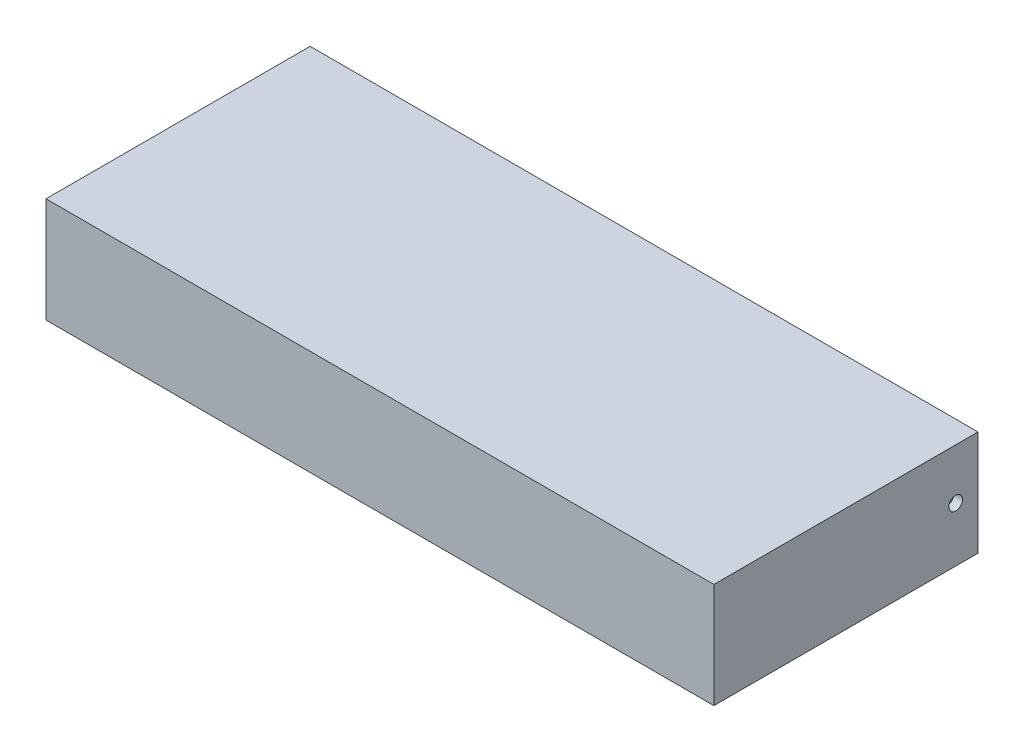
ISO-10303-21;
HEADER;
FILE_DESCRIPTION(('STEP AP214'),'2;1');
FILE_NAME('part.step','',(''),(''),'','','');
FILE_SCHEMA(('AUTOMOTIVE_DESIGN { 1 0 10303 214 1 1 1 1 }'));
ENDSEC;
DATA;
#1=APPLICATION_CONTEXT('core data for automotive mechanical design processes');
#2=APPLICATION_PROTOCOL_DEFINITION('international standard','automotive_design',2000,#1);
#3=PRODUCT_CONTEXT('',#1,'mechanical');
#4=PRODUCT('Part','Part','',(#3));
#5=PRODUCT_RELATED_PRODUCT_CATEGORY('part','',(#4));
#6=PRODUCT_DEFINITION_FORMATION('','',#4);
#7=PRODUCT_DEFINITION_CONTEXT('part definition',#1,'design');
#8=PRODUCT_DEFINITION('design','',#6,#7);
#9=PRODUCT_DEFINITION_SHAPE('','',#8);
#10=(LENGTH_UNIT() NAMED_UNIT(*) SI_UNIT(.MILLI.,.METRE.));
#11=(NAMED_UNIT(*) PLANE_ANGLE_UNIT() SI_UNIT($,.RADIAN.));
#12=(NAMED_UNIT(*) SI_UNIT($,.STERADIAN.) SOLID_ANGLE_UNIT());
#13=UNCERTAINTY_MEASURE_WITH_UNIT(LENGTH_MEASURE(1.E-05),#10,'distance_accuracy_value','');
#14=(GEOMETRIC_REPRESENTATION_CONTEXT(3) GLOBAL_UNCERTAINTY_ASSIGNED_CONTEXT((#13)) GLOBAL_UNIT_ASSIGNED_CONTEXT((#10,
#11,#12)) REPRESENTATION_CONTEXT('',''));
#15=CARTESIAN_POINT('',(0.,0.,0.));
#16=DIRECTION('',(0.,0.,1.));
#17=DIRECTION('',(1.,0.,0.));
#18=AXIS2_PLACEMENT_3D('',#15,#16,#17);
#19=CARTESIAN_POINT('',(-760.,239.,-300.5));
#20=DIRECTION('',(1.,0.,0.));
#21=DIRECTION('',(0.,0.,-1.));
#22=AXIS2_PLACEMENT_3D('',#19,#20,#21);
#23=PLANE('',#22);
#24=DIRECTION('',(0.,0.,1.));
#25=VECTOR('',#24,1.);
#26=CARTESIAN_POINT('',(-760.,0.,-300.5));
#27=LINE('',#26,#25);
#28=CARTESIAN_POINT('',(-760.,0.,-300.5));
#29=VERTEX_POINT('',#28);
#30=CARTESIAN_POINT('',(-760.,0.,300.5));
#31=VERTEX_POINT('',#30);
#32=EDGE_CURVE('E100',#29,#31,#27,.T.);
#33=ORIENTED_EDGE('',*,*,#32,.T.);
#34=DIRECTION('',(0.,-1.,0.));
#35=VECTOR('',#34,1.);
#36=CARTESIAN_POINT('',(-760.,239.,300.5));
#37=LINE('',#36,#35);
#38=CARTESIAN_POINT('',(-760.,239.,300.5));
#39=VERTEX_POINT('',#38);
#40=EDGE_CURVE('E11',#39,#31,#37,.T.);
#41=ORIENTED_EDGE('',*,*,#40,.F.);
#42=DIRECTION('',(0.,0.,1.));
#43=VECTOR('',#42,1.);
#44=CARTESIAN_POINT('',(-760.,239.,-300.5));
#45=LINE('',#44,#43);
#46=CARTESIAN_POINT('',(-760.,239.,-300.5));
#47=VERTEX_POINT('',#46);
#48=EDGE_CURVE('E88',#47,#39,#45,.T.);
#49=ORIENTED_EDGE('',*,*,#48,.F.);
#50=DIRECTION('',(0.,-1.,0.));
#51=VECTOR('',#50,1.);
#52=CARTESIAN_POINT('',(-760.,239.,-300.5));
#53=LINE('',#52,#51);
#54=EDGE_CURVE('E96',#47,#29,#53,.T.);
#55=ORIENTED_EDGE('',*,*,#54,.T.);
#56=EDGE_LOOP('',(#33,#41,#49,#55));
#57=FACE_BOUND('',#56,.T.);
#58=ADVANCED_FACE('F37',(#57),#23,.F.);
#59=CARTESIAN_POINT('',(760.,239.,300.5));
#60=DIRECTION('',(0.,0.,-1.));
#61=DIRECTION('',(-1.,0.,0.));
#62=AXIS2_PLACEMENT_3D('',#59,#60,#61);
#63=PLANE('',#62);
#64=DIRECTION('',(1.,0.,0.));
#65=VECTOR('',#64,1.);
#66=CARTESIAN_POINT('',(760.,0.,300.5));
#67=LINE('',#66,#65);
#68=CARTESIAN_POINT('',(760.,0.,300.5));
#69=VERTEX_POINT('',#68);
#70=EDGE_CURVE('E92',#31,#69,#67,.T.);
#71=ORIENTED_EDGE('',*,*,#70,.T.);
#72=DIRECTION('',(0.,-1.,0.));
#73=VECTOR('',#72,1.);
#74=CARTESIAN_POINT('',(760.,239.,300.5));
#75=LINE('',#74,#73);
#76=CARTESIAN_POINT('',(760.,239.,300.5));
#77=VERTEX_POINT('',#76);
#78=EDGE_CURVE('E45',#77,#69,#75,.T.);
#79=ORIENTED_EDGE('',*,*,#78,.F.);
#80=DIRECTION('',(1.,0.,0.));
#81=VECTOR('',#80,1.);
#82=CARTESIAN_POINT('',(760.,239.,300.5));
#83=LINE('',#82,#81);
#84=EDGE_CURVE('E83',#39,#77,#83,.T.);
#85=ORIENTED_EDGE('',*,*,#84,.F.);
#86=ORIENTED_EDGE('',*,*,#40,.T.);
#87=EDGE_LOOP('',(#71,#79,#85,#86));
#88=FACE_BOUND('',#87,.T.);
#89=ADVANCED_FACE('F91',(#88),#63,.F.);
#90=CARTESIAN_POINT('',(760.,239.,-300.5));
#91=DIRECTION('',(-1.,0.,0.));
#92=DIRECTION('',(0.,0.,1.));
#93=AXIS2_PLACEMENT_3D('',#90,#91,#92);
#94=PLANE('',#93);
#95=CARTESIAN_POINT('',(760.,124.,-249.7));
#96=DIRECTION('',(1.,0.,0.));
#97=DIRECTION('',(0.,0.,-1.));
#98=AXIS2_PLACEMENT_3D('',#95,#96,#97);
#99=CIRCLE('',#98,15.6);
#100=CARTESIAN_POINT('',(760.,124.,-265.3));
#101=VERTEX_POINT('',#100);
#102=EDGE_CURVE('E114',#101,#101,#99,.T.);
#103=ORIENTED_EDGE('',*,*,#102,.F.);
#104=EDGE_LOOP('',(#103));
#105=FACE_BOUND('',#104,.T.);
#106=DIRECTION('',(0.,0.,-1.));
#107=VECTOR('',#106,1.);
#108=CARTESIAN_POINT('',(760.,0.,-300.5));
#109=LINE('',#108,#107);
#110=CARTESIAN_POINT('',(760.,0.,-300.5));
#111=VERTEX_POINT('',#110);
#112=EDGE_CURVE('E70',#69,#111,#109,.T.);
#113=ORIENTED_EDGE('',*,*,#112,.T.);
#114=DIRECTION('',(0.,-1.,0.));
#115=VECTOR('',#114,1.);
#116=CARTESIAN_POINT('',(760.,239.,-300.5));
#117=LINE('',#116,#115);
#118=CARTESIAN_POINT('',(760.,239.,-300.5));
#119=VERTEX_POINT('',#118);
#120=EDGE_CURVE('E93',#119,#111,#117,.T.);
#121=ORIENTED_EDGE('',*,*,#120,.F.);
#122=DIRECTION('',(0.,0.,-1.));
#123=VECTOR('',#122,1.);
#124=CARTESIAN_POINT('',(760.,239.,-300.5));
#125=LINE('',#124,#123);
#126=EDGE_CURVE('E86',#77,#119,#125,.T.);
#127=ORIENTED_EDGE('',*,*,#126,.F.);
#128=ORIENTED_EDGE('',*,*,#78,.T.);
#129=EDGE_LOOP('',(#113,#121,#127,#128));
#130=FACE_BOUND('',#129,.T.);
#131=ADVANCED_FACE('F94',(#105,#130),#94,.F.);
#132=CARTESIAN_POINT('',(760.,239.,-300.5));
#133=DIRECTION('',(0.,0.,1.));
#134=DIRECTION('',(1.,0.,0.));
#135=AXIS2_PLACEMENT_3D('',#132,#133,#134);
#136=PLANE('',#135);
#137=DIRECTION('',(-1.,0.,0.));
#138=VECTOR('',#137,1.);
#139=CARTESIAN_POINT('',(760.,0.,-300.5));
#140=LINE('',#139,#138);
#141=EDGE_CURVE('E76',#111,#29,#140,.T.);
#142=ORIENTED_EDGE('',*,*,#141,.T.);
#143=ORIENTED_EDGE('',*,*,#54,.F.);
#144=DIRECTION('',(-1.,0.,0.));
#145=VECTOR('',#144,1.);
#146=CARTESIAN_POINT('',(760.,239.,-300.5));
#147=LINE('',#146,#145);
#148=EDGE_CURVE('E53',#119,#47,#147,.T.);
#149=ORIENTED_EDGE('',*,*,#148,.F.);
#150=ORIENTED_EDGE('',*,*,#120,.T.);
#151=EDGE_LOOP('',(#142,#143,#149,#150));
#152=FACE_BOUND('',#151,.T.);
#153=ADVANCED_FACE('F108',(#152),#136,.F.);
#154=CARTESIAN_POINT('',(0.,239.,0.));
#155=DIRECTION('',(0.,-1.,0.));
#156=DIRECTION('',(0.,0.,-1.));
#157=AXIS2_PLACEMENT_3D('',#154,#155,#156);
#158=PLANE('',#157);
#159=ORIENTED_EDGE('',*,*,#48,.T.);
#160=ORIENTED_EDGE('',*,*,#84,.T.);
#161=ORIENTED_EDGE('',*,*,#126,.T.);
#162=ORIENTED_EDGE('',*,*,#148,.T.);
#163=EDGE_LOOP('',(#159,#160,#161,#162));
#164=FACE_BOUND('',#163,.T.);
#165=ADVANCED_FACE('F84',(#164),#158,.F.);
#166=CARTESIAN_POINT('',(0.,0.,0.));
#167=DIRECTION('',(0.,-1.,0.));
#168=DIRECTION('',(0.,0.,-1.));
#169=AXIS2_PLACEMENT_3D('',#166,#167,#168);
#170=PLANE('',#169);
#171=ORIENTED_EDGE('',*,*,#32,.F.);
#172=ORIENTED_EDGE('',*,*,#141,.F.);
#173=ORIENTED_EDGE('',*,*,#112,.F.);
#174=ORIENTED_EDGE('',*,*,#70,.F.);
#175=EDGE_LOOP('',(#171,#172,#173,#174));
#176=FACE_BOUND('',#175,.T.);
#177=ADVANCED_FACE('F111',(#176),#170,.T.);
#178=CARTESIAN_POINT('',(740.,124.,-249.7));
#179=DIRECTION('',(1.,0.,0.));
#180=DIRECTION('',(0.,0.,-1.));
#181=AXIS2_PLACEMENT_3D('',#178,#179,#180);
#182=CYLINDRICAL_SURFACE('',#181,15.6);
#183=CARTESIAN_POINT('',(740.,124.,-249.7));
#184=DIRECTION('',(1.,0.,0.));
#185=DIRECTION('',(0.,0.,-1.));
#186=AXIS2_PLACEMENT_3D('',#183,#184,#185);
#187=CIRCLE('',#186,15.6);
#188=CARTESIAN_POINT('',(740.,124.,-265.3));
#189=VERTEX_POINT('',#188);
#190=EDGE_CURVE('E103',#189,#189,#187,.T.);
#191=ORIENTED_EDGE('',*,*,#190,.F.);
#192=EDGE_LOOP('',(#191));
#193=FACE_BOUND('',#192,.T.);
#194=ORIENTED_EDGE('',*,*,#102,.T.);
#195=EDGE_LOOP('',(#194));
#196=FACE_BOUND('',#195,.T.);
#197=ADVANCED_FACE('F122',(#193,#196),#182,.F.);
#198=CARTESIAN_POINT('',(740.,124.,-249.7));
#199=DIRECTION('',(1.,0.,0.));
#200=DIRECTION('',(0.,0.,-1.));
#201=AXIS2_PLACEMENT_3D('',#198,#199,#200);
#202=PLANE('',#201);
#203=ORIENTED_EDGE('',*,*,#190,.T.);
#204=EDGE_LOOP('',(#203));
#205=FACE_BOUND('',#204,.T.);
#206=ADVANCED_FACE('F120',(#205),#202,.T.);
#207=CLOSED_SHELL('',(#58,#89,#131,#153,#165,#177,#197,#206));
#208=MANIFOLD_SOLID_BREP('B2',#207);
#209=ADVANCED_BREP_SHAPE_REPRESENTATION('',(#18,#208),#14);
#210=SHAPE_DEFINITION_REPRESENTATION(#9,#209);
ENDSEC;
END-ISO-10303-21;
